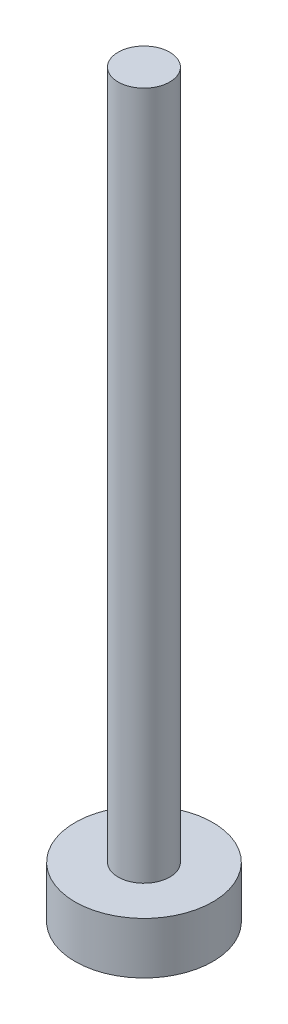
ISO-10303-21;
HEADER;
FILE_DESCRIPTION(('STEP AP214'),'2;1');
FILE_NAME('part.step','',(''),(''),'','','');
FILE_SCHEMA(('AUTOMOTIVE_DESIGN { 1 0 10303 214 1 1 1 1 }'));
ENDSEC;
DATA;
#1=APPLICATION_CONTEXT('core data for automotive mechanical design processes');
#2=APPLICATION_PROTOCOL_DEFINITION('international standard','automotive_design',2000,#1);
#3=PRODUCT_CONTEXT('',#1,'mechanical');
#4=PRODUCT('Part','Part','',(#3));
#5=PRODUCT_RELATED_PRODUCT_CATEGORY('part','',(#4));
#6=PRODUCT_DEFINITION_FORMATION('','',#4);
#7=PRODUCT_DEFINITION_CONTEXT('part definition',#1,'design');
#8=PRODUCT_DEFINITION('design','',#6,#7);
#9=PRODUCT_DEFINITION_SHAPE('','',#8);
#10=(LENGTH_UNIT() NAMED_UNIT(*) SI_UNIT(.MILLI.,.METRE.));
#11=(NAMED_UNIT(*) PLANE_ANGLE_UNIT() SI_UNIT($,.RADIAN.));
#12=(NAMED_UNIT(*) SI_UNIT($,.STERADIAN.) SOLID_ANGLE_UNIT());
#13=UNCERTAINTY_MEASURE_WITH_UNIT(LENGTH_MEASURE(1.E-05),#10,'distance_accuracy_value','');
#14=(GEOMETRIC_REPRESENTATION_CONTEXT(3) GLOBAL_UNCERTAINTY_ASSIGNED_CONTEXT((#13)) GLOBAL_UNIT_ASSIGNED_CONTEXT((#10,
#11,#12)) REPRESENTATION_CONTEXT('',''));
#15=CARTESIAN_POINT('',(0.,0.,0.));
#16=DIRECTION('',(0.,0.,1.));
#17=DIRECTION('',(1.,0.,0.));
#18=AXIS2_PLACEMENT_3D('',#15,#16,#17);
#19=CARTESIAN_POINT('',(0.,3.,0.));
#20=DIRECTION('',(0.,-1.,0.));
#21=DIRECTION('',(0.,0.,-1.));
#22=AXIS2_PLACEMENT_3D('',#19,#20,#21);
#23=CYLINDRICAL_SURFACE('',#22,4.);
#24=CARTESIAN_POINT('',(0.,3.,0.));
#25=DIRECTION('',(0.,1.,0.));
#26=DIRECTION('',(0.,0.,1.));
#27=AXIS2_PLACEMENT_3D('',#24,#25,#26);
#28=CIRCLE('',#27,4.);
#29=CARTESIAN_POINT('',(0.,3.,4.));
#30=VERTEX_POINT('',#29);
#31=EDGE_CURVE('E38',#30,#30,#28,.T.);
#32=ORIENTED_EDGE('',*,*,#31,.F.);
#33=EDGE_LOOP('',(#32));
#34=FACE_BOUND('',#33,.T.);
#35=CARTESIAN_POINT('',(0.,0.,0.));
#36=DIRECTION('',(0.,1.,0.));
#37=DIRECTION('',(0.,0.,1.));
#38=AXIS2_PLACEMENT_3D('',#35,#36,#37);
#39=CIRCLE('',#38,4.);
#40=CARTESIAN_POINT('',(0.,0.,4.));
#41=VERTEX_POINT('',#40);
#42=EDGE_CURVE('E34',#41,#41,#39,.T.);
#43=ORIENTED_EDGE('',*,*,#42,.T.);
#44=EDGE_LOOP('',(#43));
#45=FACE_BOUND('',#44,.T.);
#46=ADVANCED_FACE('F31',(#34,#45),#23,.T.);
#47=CARTESIAN_POINT('',(0.,3.,0.));
#48=DIRECTION('',(0.,1.,0.));
#49=DIRECTION('',(0.,0.,1.));
#50=AXIS2_PLACEMENT_3D('',#47,#48,#49);
#51=PLANE('',#50);
#52=CARTESIAN_POINT('',(0.,3.,0.));
#53=DIRECTION('',(0.,1.,0.));
#54=DIRECTION('',(0.,0.,1.));
#55=AXIS2_PLACEMENT_3D('',#52,#53,#54);
#56=CIRCLE('',#55,1.5);
#57=CARTESIAN_POINT('',(0.,3.,1.5));
#58=VERTEX_POINT('',#57);
#59=EDGE_CURVE('E10',#58,#58,#56,.T.);
#60=ORIENTED_EDGE('',*,*,#59,.F.);
#61=EDGE_LOOP('',(#60));
#62=FACE_BOUND('',#61,.T.);
#63=ORIENTED_EDGE('',*,*,#31,.T.);
#64=EDGE_LOOP('',(#63));
#65=FACE_BOUND('',#64,.T.);
#66=ADVANCED_FACE('F55',(#62,#65),#51,.T.);
#67=CARTESIAN_POINT('',(0.,0.,0.));
#68=DIRECTION('',(0.,1.,0.));
#69=DIRECTION('',(0.,0.,1.));
#70=AXIS2_PLACEMENT_3D('',#67,#68,#69);
#71=PLANE('',#70);
#72=ORIENTED_EDGE('',*,*,#42,.F.);
#73=EDGE_LOOP('',(#72));
#74=FACE_BOUND('',#73,.T.);
#75=ADVANCED_FACE('F52',(#74),#71,.F.);
#76=CARTESIAN_POINT('',(0.,43.,0.));
#77=DIRECTION('',(0.,-1.,0.));
#78=DIRECTION('',(0.,0.,-1.));
#79=AXIS2_PLACEMENT_3D('',#76,#77,#78);
#80=CYLINDRICAL_SURFACE('',#79,1.5);
#81=CARTESIAN_POINT('',(0.,43.,0.));
#82=DIRECTION('',(0.,1.,0.));
#83=DIRECTION('',(0.,0.,1.));
#84=AXIS2_PLACEMENT_3D('',#81,#82,#83);
#85=CIRCLE('',#84,1.5);
#86=CARTESIAN_POINT('',(0.,43.,1.5));
#87=VERTEX_POINT('',#86);
#88=EDGE_CURVE('E44',#87,#87,#85,.T.);
#89=ORIENTED_EDGE('',*,*,#88,.F.);
#90=EDGE_LOOP('',(#89));
#91=FACE_BOUND('',#90,.T.);
#92=ORIENTED_EDGE('',*,*,#59,.T.);
#93=EDGE_LOOP('',(#92));
#94=FACE_BOUND('',#93,.T.);
#95=ADVANCED_FACE('F54',(#91,#94),#80,.T.);
#96=CARTESIAN_POINT('',(0.,43.,0.));
#97=DIRECTION('',(0.,1.,0.));
#98=DIRECTION('',(0.,0.,1.));
#99=AXIS2_PLACEMENT_3D('',#96,#97,#98);
#100=PLANE('',#99);
#101=ORIENTED_EDGE('',*,*,#88,.T.);
#102=EDGE_LOOP('',(#101));
#103=FACE_BOUND('',#102,.T.);
#104=ADVANCED_FACE('F60',(#103),#100,.T.);
#105=CLOSED_SHELL('',(#46,#66,#75,#95,#104));
#106=MANIFOLD_SOLID_BREP('B2',#105);
#107=ADVANCED_BREP_SHAPE_REPRESENTATION('',(#18,#106),#14);
#108=SHAPE_DEFINITION_REPRESENTATION(#9,#107);
ENDSEC;
END-ISO-10303-21;
